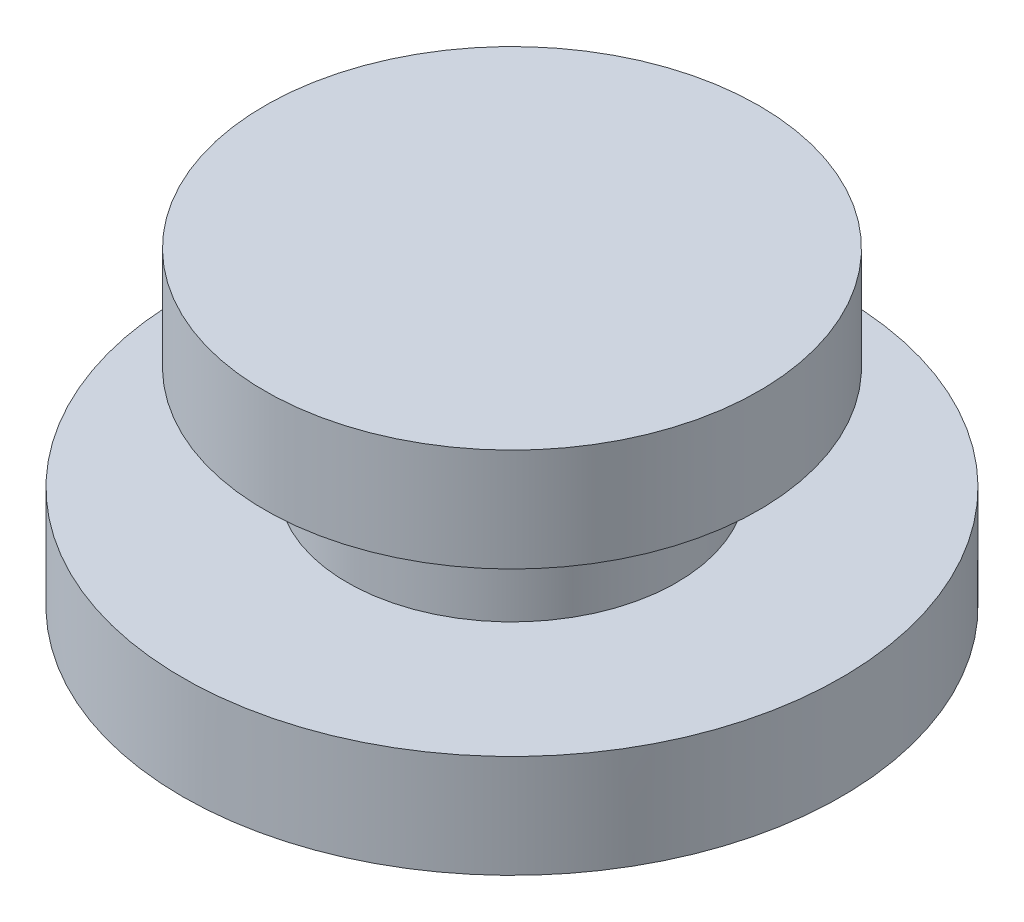
ISO-10303-21;
HEADER;
FILE_DESCRIPTION(('STEP AP214'),'2;1');
FILE_NAME('part.step','',(''),(''),'','','');
FILE_SCHEMA(('AUTOMOTIVE_DESIGN { 1 0 10303 214 1 1 1 1 }'));
ENDSEC;
DATA;
#1=APPLICATION_CONTEXT('core data for automotive mechanical design processes');
#2=APPLICATION_PROTOCOL_DEFINITION('international standard','automotive_design',2000,#1);
#3=PRODUCT_CONTEXT('',#1,'mechanical');
#4=PRODUCT('Part','Part','',(#3));
#5=PRODUCT_RELATED_PRODUCT_CATEGORY('part','',(#4));
#6=PRODUCT_DEFINITION_FORMATION('','',#4);
#7=PRODUCT_DEFINITION_CONTEXT('part definition',#1,'design');
#8=PRODUCT_DEFINITION('design','',#6,#7);
#9=PRODUCT_DEFINITION_SHAPE('','',#8);
#10=(LENGTH_UNIT() NAMED_UNIT(*) SI_UNIT(.MILLI.,.METRE.));
#11=(NAMED_UNIT(*) PLANE_ANGLE_UNIT() SI_UNIT($,.RADIAN.));
#12=(NAMED_UNIT(*) SI_UNIT($,.STERADIAN.) SOLID_ANGLE_UNIT());
#13=UNCERTAINTY_MEASURE_WITH_UNIT(LENGTH_MEASURE(1.E-05),#10,'distance_accuracy_value','');
#14=(GEOMETRIC_REPRESENTATION_CONTEXT(3) GLOBAL_UNCERTAINTY_ASSIGNED_CONTEXT((#13)) GLOBAL_UNIT_ASSIGNED_CONTEXT((#10,
#11,#12)) REPRESENTATION_CONTEXT('',''));
#15=CARTESIAN_POINT('',(0.,0.,0.));
#16=DIRECTION('',(0.,0.,1.));
#17=DIRECTION('',(1.,0.,0.));
#18=AXIS2_PLACEMENT_3D('',#15,#16,#17);
#19=CARTESIAN_POINT('',(0.,110.,0.));
#20=DIRECTION('',(0.,1.,0.));
#21=DIRECTION('',(0.,0.,1.));
#22=AXIS2_PLACEMENT_3D('',#19,#20,#21);
#23=PLANE('',#22);
#24=CARTESIAN_POINT('',(0.,110.,0.));
#25=DIRECTION('',(0.,-1.,0.));
#26=DIRECTION('',(0.,0.,-1.));
#27=AXIS2_PLACEMENT_3D('',#24,#25,#26);
#28=CIRCLE('',#27,120.);
#29=CARTESIAN_POINT('',(0.,110.,-120.));
#30=VERTEX_POINT('',#29);
#31=EDGE_CURVE('E10',#30,#30,#28,.T.);
#32=ORIENTED_EDGE('',*,*,#31,.F.);
#33=EDGE_LOOP('',(#32));
#34=FACE_BOUND('',#33,.T.);
#35=ADVANCED_FACE('F40',(#34),#23,.T.);
#36=CARTESIAN_POINT('',(0.,-110.,0.));
#37=DIRECTION('',(0.,-1.,0.));
#38=DIRECTION('',(0.,0.,-1.));
#39=AXIS2_PLACEMENT_3D('',#36,#37,#38);
#40=CYLINDRICAL_SURFACE('',#39,120.);
#41=ORIENTED_EDGE('',*,*,#31,.T.);
#42=EDGE_LOOP('',(#41));
#43=FACE_BOUND('',#42,.T.);
#44=CARTESIAN_POINT('',(0.,60.,0.));
#45=DIRECTION('',(0.,-1.,0.));
#46=DIRECTION('',(0.,0.,-1.));
#47=AXIS2_PLACEMENT_3D('',#44,#45,#46);
#48=CIRCLE('',#47,120.);
#49=CARTESIAN_POINT('',(0.,60.,-120.));
#50=VERTEX_POINT('',#49);
#51=EDGE_CURVE('E43',#50,#50,#48,.T.);
#52=ORIENTED_EDGE('',*,*,#51,.F.);
#53=EDGE_LOOP('',(#52));
#54=FACE_BOUND('',#53,.T.);
#55=ADVANCED_FACE('F82',(#43,#54),#40,.T.);
#56=CARTESIAN_POINT('',(0.,60.,-120.));
#57=DIRECTION('',(0.,-1.,0.));
#58=DIRECTION('',(0.,0.,-1.));
#59=AXIS2_PLACEMENT_3D('',#56,#57,#58);
#60=PLANE('',#59);
#61=ORIENTED_EDGE('',*,*,#51,.T.);
#62=EDGE_LOOP('',(#61));
#63=FACE_BOUND('',#62,.T.);
#64=CARTESIAN_POINT('',(0.,60.,0.));
#65=DIRECTION('',(0.,-1.,0.));
#66=DIRECTION('',(0.,0.,-1.));
#67=AXIS2_PLACEMENT_3D('',#64,#65,#66);
#68=CIRCLE('',#67,80.);
#69=CARTESIAN_POINT('',(0.,60.,-80.));
#70=VERTEX_POINT('',#69);
#71=EDGE_CURVE('E50',#70,#70,#68,.T.);
#72=ORIENTED_EDGE('',*,*,#71,.F.);
#73=EDGE_LOOP('',(#72));
#74=FACE_BOUND('',#73,.T.);
#75=ADVANCED_FACE('F89',(#63,#74),#60,.T.);
#76=CARTESIAN_POINT('',(0.,-110.,0.));
#77=DIRECTION('',(0.,-1.,0.));
#78=DIRECTION('',(0.,0.,-1.));
#79=AXIS2_PLACEMENT_3D('',#76,#77,#78);
#80=CYLINDRICAL_SURFACE('',#79,80.);
#81=ORIENTED_EDGE('',*,*,#71,.T.);
#82=EDGE_LOOP('',(#81));
#83=FACE_BOUND('',#82,.T.);
#84=CARTESIAN_POINT('',(0.,9.47441116742319,0.));
#85=DIRECTION('',(0.,-1.,0.));
#86=DIRECTION('',(0.,0.,-1.));
#87=AXIS2_PLACEMENT_3D('',#84,#85,#86);
#88=CIRCLE('',#87,80.);
#89=CARTESIAN_POINT('',(0.,9.47441116742319,-80.));
#90=VERTEX_POINT('',#89);
#91=EDGE_CURVE('E51',#90,#90,#88,.T.);
#92=ORIENTED_EDGE('',*,*,#91,.F.);
#93=EDGE_LOOP('',(#92));
#94=FACE_BOUND('',#93,.T.);
#95=ADVANCED_FACE('F92',(#83,#94),#80,.T.);
#96=CARTESIAN_POINT('',(0.,9.4744111674232,-80.));
#97=DIRECTION('',(0.,1.,0.));
#98=DIRECTION('',(0.,0.,1.));
#99=AXIS2_PLACEMENT_3D('',#96,#97,#98);
#100=PLANE('',#99);
#101=ORIENTED_EDGE('',*,*,#91,.T.);
#102=EDGE_LOOP('',(#101));
#103=FACE_BOUND('',#102,.T.);
#104=CARTESIAN_POINT('',(0.,9.47441116742319,0.));
#105=DIRECTION('',(0.,-1.,0.));
#106=DIRECTION('',(0.,0.,-1.));
#107=AXIS2_PLACEMENT_3D('',#104,#105,#106);
#108=CIRCLE('',#107,160.);
#109=CARTESIAN_POINT('',(0.,9.47441116742319,-160.));
#110=VERTEX_POINT('',#109);
#111=EDGE_CURVE('E57',#110,#110,#108,.T.);
#112=ORIENTED_EDGE('',*,*,#111,.F.);
#113=EDGE_LOOP('',(#112));
#114=FACE_BOUND('',#113,.T.);
#115=ADVANCED_FACE('F99',(#103,#114),#100,.T.);
#116=CARTESIAN_POINT('',(0.,-110.,0.));
#117=DIRECTION('',(0.,-1.,0.));
#118=DIRECTION('',(0.,0.,-1.));
#119=AXIS2_PLACEMENT_3D('',#116,#117,#118);
#120=CYLINDRICAL_SURFACE('',#119,160.);
#121=ORIENTED_EDGE('',*,*,#111,.T.);
#122=EDGE_LOOP('',(#121));
#123=FACE_BOUND('',#122,.T.);
#124=CARTESIAN_POINT('',(0.,-40.5255888325768,0.));
#125=DIRECTION('',(0.,-1.,0.));
#126=DIRECTION('',(0.,0.,-1.));
#127=AXIS2_PLACEMENT_3D('',#124,#125,#126);
#128=CIRCLE('',#127,160.);
#129=CARTESIAN_POINT('',(0.,-40.5255888325768,160.));
#130=VERTEX_POINT('',#129);
#131=EDGE_CURVE('E56',#130,#130,#128,.T.);
#132=ORIENTED_EDGE('',*,*,#131,.F.);
#133=EDGE_LOOP('',(#132));
#134=FACE_BOUND('',#133,.T.);
#135=ADVANCED_FACE('F83',(#123,#134),#120,.T.);
#136=CARTESIAN_POINT('',(0.,-70.,0.));
#137=DIRECTION('',(0.,1.,0.));
#138=DIRECTION('',(0.,0.,1.));
#139=AXIS2_PLACEMENT_3D('',#136,#137,#138);
#140=CONICAL_SURFACE('',#139,50.,1.30899693899575);
#141=CARTESIAN_POINT('',(0.,-70.,0.));
#142=DIRECTION('',(0.,-1.,0.));
#143=DIRECTION('',(0.,0.,-1.));
#144=AXIS2_PLACEMENT_3D('',#141,#142,#143);
#145=CIRCLE('',#144,50.);
#146=CARTESIAN_POINT('',(0.,-70.,50.));
#147=VERTEX_POINT('',#146);
#148=EDGE_CURVE('E62',#147,#147,#145,.T.);
#149=CARTESIAN_POINT('',(0.,-40.5255888325768,160.));
#150=CARTESIAN_POINT('',(0.,-40.8326139489041,158.854166666667));
#151=CARTESIAN_POINT('',(0.,-41.1396390652314,157.708333333333));
#152=CARTESIAN_POINT('',(0.,-41.7536892978861,155.416666666667));
#153=CARTESIAN_POINT('',(0.,-42.0607144142134,154.270833333333));
#154=CARTESIAN_POINT('',(0.,-42.6747646468681,151.979166666667));
#155=CARTESIAN_POINT('',(0.,-42.9817897631954,150.833333333333));
#156=CARTESIAN_POINT('',(0.,-43.59583999585,148.541666666667));
#157=CARTESIAN_POINT('',(0.,-43.9028651121774,147.395833333333));
#158=CARTESIAN_POINT('',(0.,-44.516915344832,145.104166666667));
#159=CARTESIAN_POINT('',(0.,-44.8239404611593,143.958333333333));
#160=CARTESIAN_POINT('',(0.,-45.437990693814,141.666666666667));
#161=CARTESIAN_POINT('',(0.,-45.7450158101413,140.520833333333));
#162=CARTESIAN_POINT('',(0.,-46.359066042796,138.229166666667));
#163=CARTESIAN_POINT('',(0.,-46.6660911591233,137.083333333333));
#164=CARTESIAN_POINT('',(0.,-47.2801413917779,134.791666666667));
#165=CARTESIAN_POINT('',(0.,-47.5871665081053,133.645833333333));
#166=CARTESIAN_POINT('',(0.,-48.2012167407599,131.354166666667));
#167=CARTESIAN_POINT('',(0.,-48.5082418570872,130.208333333333));
#168=CARTESIAN_POINT('',(0.,-49.1222920897419,127.916666666667));
#169=CARTESIAN_POINT('',(0.,-49.4293172060692,126.770833333333));
#170=CARTESIAN_POINT('',(0.,-50.0433674387239,124.479166666667));
#171=CARTESIAN_POINT('',(0.,-50.3503925550512,123.333333333333));
#172=CARTESIAN_POINT('',(0.,-50.9644427877058,121.041666666667));
#173=CARTESIAN_POINT('',(0.,-51.2714679040332,119.895833333333));
#174=CARTESIAN_POINT('',(0.,-51.8855181366878,117.604166666667));
#175=CARTESIAN_POINT('',(0.,-52.1925432530151,116.458333333333));
#176=CARTESIAN_POINT('',(0.,-52.8065934856698,114.166666666667));
#177=CARTESIAN_POINT('',(0.,-53.1136186019971,113.020833333333));
#178=CARTESIAN_POINT('',(0.,-53.7276688346518,110.729166666667));
#179=CARTESIAN_POINT('',(0.,-54.0346939509791,109.583333333333));
#180=CARTESIAN_POINT('',(0.,-54.6487441836337,107.291666666667));
#181=CARTESIAN_POINT('',(0.,-54.9557692999611,106.145833333333));
#182=CARTESIAN_POINT('',(0.,-55.5698195326157,103.854166666667));
#183=CARTESIAN_POINT('',(0.,-55.876844648943,102.708333333333));
#184=CARTESIAN_POINT('',(0.,-56.4908948815977,100.416666666667));
#185=CARTESIAN_POINT('',(0.,-56.797919997925,99.2708333333334));
#186=CARTESIAN_POINT('',(0.,-57.4119702305797,96.9791666666667));
#187=CARTESIAN_POINT('',(0.,-57.718995346907,95.8333333333334));
#188=CARTESIAN_POINT('',(0.,-58.3330455795616,93.5416666666667));
#189=CARTESIAN_POINT('',(0.,-58.640070695889,92.3958333333334));
#190=CARTESIAN_POINT('',(0.,-59.2541209285436,90.1041666666667));
#191=CARTESIAN_POINT('',(0.,-59.5611460448709,88.9583333333334));
#192=CARTESIAN_POINT('',(0.,-60.1751962775256,86.6666666666667));
#193=CARTESIAN_POINT('',(0.,-60.4822213938529,85.5208333333334));
#194=CARTESIAN_POINT('',(0.,-61.0962716265076,83.2291666666667));
#195=CARTESIAN_POINT('',(0.,-61.4032967428349,82.0833333333334));
#196=CARTESIAN_POINT('',(0.,-62.0173469754895,79.7916666666667));
#197=CARTESIAN_POINT('',(0.,-62.3243720918168,78.6458333333334));
#198=CARTESIAN_POINT('',(0.,-62.9384223244715,76.3541666666667));
#199=CARTESIAN_POINT('',(0.,-63.2454474407988,75.2083333333334));
#200=CARTESIAN_POINT('',(0.,-63.8594976734535,72.9166666666667));
#201=CARTESIAN_POINT('',(0.,-64.1665227897808,71.7708333333334));
#202=CARTESIAN_POINT('',(0.,-64.7805730224354,69.4791666666667));
#203=CARTESIAN_POINT('',(0.,-65.0875981387628,68.3333333333334));
#204=CARTESIAN_POINT('',(0.,-65.7016483714174,66.0416666666667));
#205=CARTESIAN_POINT('',(0.,-66.0086734877447,64.8958333333334));
#206=CARTESIAN_POINT('',(0.,-66.6227237203994,62.6041666666667));
#207=CARTESIAN_POINT('',(0.,-66.9297488367267,61.4583333333334));
#208=CARTESIAN_POINT('',(0.,-67.5437990693814,59.1666666666667));
#209=CARTESIAN_POINT('',(0.,-67.8508241857087,58.0208333333334));
#210=CARTESIAN_POINT('',(0.,-68.4648744183634,55.7291666666667));
#211=CARTESIAN_POINT('',(0.,-68.7718995346907,54.5833333333334));
#212=CARTESIAN_POINT('',(0.,-69.3859497673453,52.2916666666667));
#213=CARTESIAN_POINT('',(0.,-69.6929748836726,51.1458333333334));
#214=CARTESIAN_POINT('',(0.,-70.,50.));
#215=B_SPLINE_CURVE_WITH_KNOTS('',3,(#149,#150,#151,#152,#153,#154,#155,#156,#157,#158,#159,
#160,#161,#162,#163,#164,#165,#166,#167,#168,#169,#170,#171,#172,#173,#174,#175,#176,#177,#178,
#179,#180,#181,#182,#183,#184,#185,#186,#187,#188,#189,#190,#191,#192,#193,#194,#195,#196,#197,
#198,#199,#200,#201,#202,#203,#204,#205,#206,#207,#208,#209,#210,#211,#212,#213,#214),
.UNSPECIFIED.,.F.,.F.,(4,2,2,2,2,2,2,2,2,2,2,2,2,2,2,2,2,2,2,2,2,2,2,2,2,2,2,2,2,2,2,2,4),(0.,
3.55876187015967,7.11752374031933,10.676285610479,14.2350474806386,17.7938093507983,
21.352571220958,24.9113330911176,28.4700949612773,32.0288568314369,35.5876187015966,
39.1463805717562,42.7051424419159,46.2639043120755,49.8226661822352,53.3814280523949,
56.9401899225545,60.4989517927142,64.0577136628738,67.6164755330335,71.1752374031932,
74.7339992733528,78.2927611435125,81.8515230136721,85.4102848838318,88.9690467539915,
92.5278086241511,96.0865704943108,99.6453323644705,103.20409423463,106.76285610479,
110.321617974949,113.880379845109),.UNSPECIFIED.);
#216=EDGE_CURVE('BSEAM74',#130,#147,#215,.T.);
#217=ORIENTED_EDGE('',*,*,#131,.T.);
#218=ORIENTED_EDGE('',*,*,#148,.F.);
#219=ORIENTED_EDGE('',*,*,#216,.T.);
#220=ORIENTED_EDGE('',*,*,#216,.F.);
#221=EDGE_LOOP('',(#217,#219,#218,#220));
#222=FACE_BOUND('',#221,.T.);
#223=ADVANCED_FACE('F74',(#222),#140,.T.);
#224=CARTESIAN_POINT('',(0.,-110.,0.));
#225=DIRECTION('',(0.,-1.,0.));
#226=DIRECTION('',(0.,0.,-1.));
#227=AXIS2_PLACEMENT_3D('',#224,#225,#226);
#228=CYLINDRICAL_SURFACE('',#227,50.);
#229=ORIENTED_EDGE('',*,*,#148,.T.);
#230=EDGE_LOOP('',(#229));
#231=FACE_BOUND('',#230,.T.);
#232=CARTESIAN_POINT('',(0.,-110.,0.));
#233=DIRECTION('',(0.,-1.,0.));
#234=DIRECTION('',(0.,0.,-1.));
#235=AXIS2_PLACEMENT_3D('',#232,#233,#234);
#236=CIRCLE('',#235,50.);
#237=CARTESIAN_POINT('',(0.,-110.,-50.));
#238=VERTEX_POINT('',#237);
#239=EDGE_CURVE('E65',#238,#238,#236,.T.);
#240=ORIENTED_EDGE('',*,*,#239,.F.);
#241=EDGE_LOOP('',(#240));
#242=FACE_BOUND('',#241,.T.);
#243=ADVANCED_FACE('F71',(#231,#242),#228,.T.);
#244=CARTESIAN_POINT('',(0.,-110.,-50.));
#245=DIRECTION('',(0.,-1.,0.));
#246=DIRECTION('',(0.,0.,-1.));
#247=AXIS2_PLACEMENT_3D('',#244,#245,#246);
#248=PLANE('',#247);
#249=ORIENTED_EDGE('',*,*,#239,.T.);
#250=EDGE_LOOP('',(#249));
#251=FACE_BOUND('',#250,.T.);
#252=ADVANCED_FACE('F69',(#251),#248,.T.);
#253=CLOSED_SHELL('',(#35,#55,#75,#95,#115,#135,#223,#243,#252));
#254=MANIFOLD_SOLID_BREP('B2',#253);
#255=ADVANCED_BREP_SHAPE_REPRESENTATION('',(#18,#254),#14);
#256=SHAPE_DEFINITION_REPRESENTATION(#9,#255);
ENDSEC;
END-ISO-10303-21;
